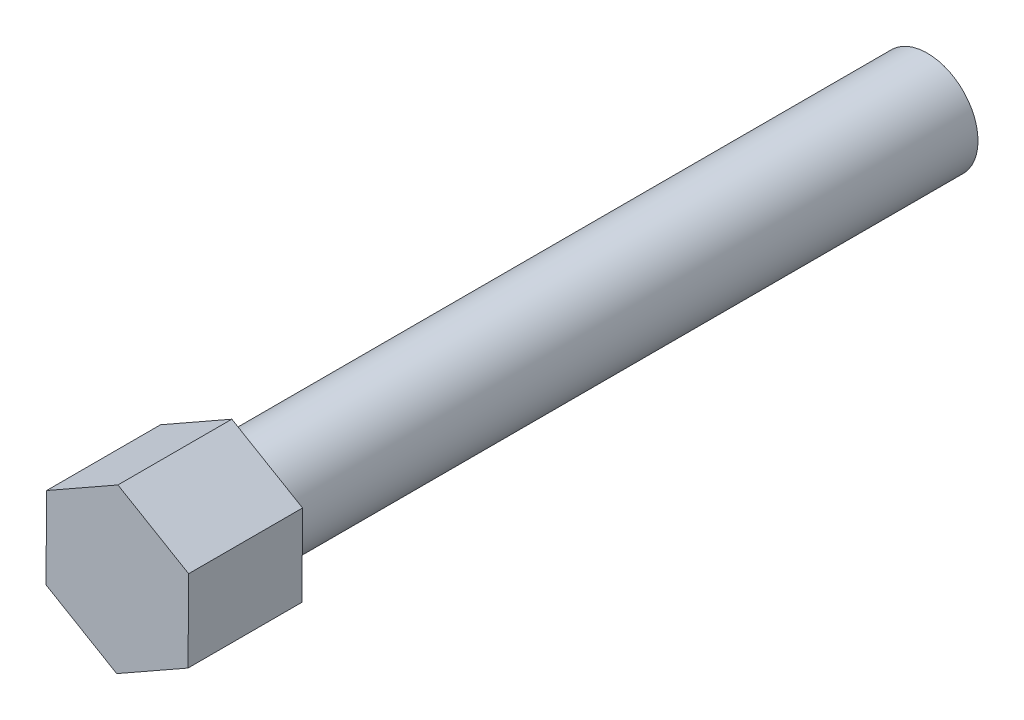
ISO-10303-21;
HEADER;
FILE_DESCRIPTION(('STEP AP214'),'2;1');
FILE_NAME('part.step','',(''),(''),'','','');
FILE_SCHEMA(('AUTOMOTIVE_DESIGN { 1 0 10303 214 1 1 1 1 }'));
ENDSEC;
DATA;
#1=APPLICATION_CONTEXT('core data for automotive mechanical design processes');
#2=APPLICATION_PROTOCOL_DEFINITION('international standard','automotive_design',2000,#1);
#3=PRODUCT_CONTEXT('',#1,'mechanical');
#4=PRODUCT('Part','Part','',(#3));
#5=PRODUCT_RELATED_PRODUCT_CATEGORY('part','',(#4));
#6=PRODUCT_DEFINITION_FORMATION('','',#4);
#7=PRODUCT_DEFINITION_CONTEXT('part definition',#1,'design');
#8=PRODUCT_DEFINITION('design','',#6,#7);
#9=PRODUCT_DEFINITION_SHAPE('','',#8);
#10=(LENGTH_UNIT() NAMED_UNIT(*) SI_UNIT(.MILLI.,.METRE.));
#11=(NAMED_UNIT(*) PLANE_ANGLE_UNIT() SI_UNIT($,.RADIAN.));
#12=(NAMED_UNIT(*) SI_UNIT($,.STERADIAN.) SOLID_ANGLE_UNIT());
#13=UNCERTAINTY_MEASURE_WITH_UNIT(LENGTH_MEASURE(1.E-05),#10,'distance_accuracy_value','');
#14=(GEOMETRIC_REPRESENTATION_CONTEXT(3) GLOBAL_UNCERTAINTY_ASSIGNED_CONTEXT((#13)) GLOBAL_UNIT_ASSIGNED_CONTEXT((#10,
#11,#12)) REPRESENTATION_CONTEXT('',''));
#15=CARTESIAN_POINT('',(0.,0.,0.));
#16=DIRECTION('',(0.,0.,1.));
#17=DIRECTION('',(1.,0.,0.));
#18=AXIS2_PLACEMENT_3D('',#15,#16,#17);
#19=CARTESIAN_POINT('',(0.,0.,55.));
#20=DIRECTION('',(0.,0.,-1.));
#21=DIRECTION('',(-1.,0.,0.));
#22=AXIS2_PLACEMENT_3D('',#19,#20,#21);
#23=CYLINDRICAL_SURFACE('',#22,4.);
#24=CARTESIAN_POINT('',(0.,0.,55.));
#25=DIRECTION('',(0.,0.,1.));
#26=DIRECTION('',(1.,0.,0.));
#27=AXIS2_PLACEMENT_3D('',#24,#25,#26);
#28=CIRCLE('',#27,4.);
#29=CARTESIAN_POINT('',(4.,0.,55.));
#30=VERTEX_POINT('',#29);
#31=EDGE_CURVE('E11',#30,#30,#28,.T.);
#32=ORIENTED_EDGE('',*,*,#31,.F.);
#33=EDGE_LOOP('',(#32));
#34=FACE_BOUND('',#33,.T.);
#35=CARTESIAN_POINT('',(0.,0.,0.));
#36=DIRECTION('',(0.,0.,1.));
#37=DIRECTION('',(1.,0.,0.));
#38=AXIS2_PLACEMENT_3D('',#35,#36,#37);
#39=CIRCLE('',#38,4.);
#40=CARTESIAN_POINT('',(4.,0.,0.));
#41=VERTEX_POINT('',#40);
#42=EDGE_CURVE('E40',#41,#41,#39,.T.);
#43=ORIENTED_EDGE('',*,*,#42,.T.);
#44=EDGE_LOOP('',(#43));
#45=FACE_BOUND('',#44,.T.);
#46=ADVANCED_FACE('F33',(#34,#45),#23,.T.);
#47=CARTESIAN_POINT('',(0.,0.,0.));
#48=DIRECTION('',(0.,0.,1.));
#49=DIRECTION('',(1.,0.,0.));
#50=AXIS2_PLACEMENT_3D('',#47,#48,#49);
#51=PLANE('',#50);
#52=ORIENTED_EDGE('',*,*,#42,.F.);
#53=EDGE_LOOP('',(#52));
#54=FACE_BOUND('',#53,.T.);
#55=ADVANCED_FACE('F141',(#54),#51,.F.);
#56=CARTESIAN_POINT('',(-5.5871853546911,3.28054919908483,55.));
#57=DIRECTION('',(0.,0.,1.));
#58=DIRECTION('',(1.,0.,0.));
#59=AXIS2_PLACEMENT_3D('',#56,#57,#58);
#60=PLANE('',#59);
#61=DIRECTION('',(-0.86966367276329,-0.493644706520656,0.));
#62=VECTOR('',#61,1.);
#63=CARTESIAN_POINT('',(0.0474462674266083,6.47891905235728,55.));
#64=LINE('',#63,#62);
#65=CARTESIAN_POINT('',(0.0474462674266083,6.47891905235728,55.));
#66=VERTEX_POINT('',#65);
#67=CARTESIAN_POINT('',(-5.5871853546911,3.28054919908483,55.));
#68=VERTEX_POINT('',#67);
#69=EDGE_CURVE('E91',#66,#68,#64,.T.);
#70=ORIENTED_EDGE('',*,*,#69,.F.);
#71=DIRECTION('',(-0.862340692672247,0.506328480101159,0.));
#72=VECTOR('',#71,1.);
#73=CARTESIAN_POINT('',(5.63463162211771,3.19836985327244,55.));
#74=LINE('',#73,#72);
#75=CARTESIAN_POINT('',(5.63463162211771,3.19836985327244,55.));
#76=VERTEX_POINT('',#75);
#77=EDGE_CURVE('E116',#76,#66,#74,.T.);
#78=ORIENTED_EDGE('',*,*,#77,.F.);
#79=DIRECTION('',(0.00732298009104386,0.999973186621815,0.));
#80=VECTOR('',#79,1.);
#81=CARTESIAN_POINT('',(5.5871853546911,-3.28054919908483,55.));
#82=LINE('',#81,#80);
#83=CARTESIAN_POINT('',(5.5871853546911,-3.28054919908483,55.));
#84=VERTEX_POINT('',#83);
#85=EDGE_CURVE('E114',#84,#76,#82,.T.);
#86=ORIENTED_EDGE('',*,*,#85,.F.);
#87=DIRECTION('',(0.869663672763291,0.493644706520656,0.));
#88=VECTOR('',#87,1.);
#89=CARTESIAN_POINT('',(-0.0474462674266069,-6.47891905235728,55.));
#90=LINE('',#89,#88);
#91=CARTESIAN_POINT('',(-0.0474462674266069,-6.47891905235728,55.));
#92=VERTEX_POINT('',#91);
#93=EDGE_CURVE('E112',#92,#84,#90,.T.);
#94=ORIENTED_EDGE('',*,*,#93,.F.);
#95=DIRECTION('',(0.862340692672247,-0.506328480101159,0.));
#96=VECTOR('',#95,1.);
#97=CARTESIAN_POINT('',(-5.63463162211771,-3.19836985327245,55.));
#98=LINE('',#97,#96);
#99=CARTESIAN_POINT('',(-5.63463162211771,-3.19836985327245,55.));
#100=VERTEX_POINT('',#99);
#101=EDGE_CURVE('E93',#100,#92,#98,.T.);
#102=ORIENTED_EDGE('',*,*,#101,.F.);
#103=DIRECTION('',(-0.00732298009104346,-0.999973186621814,0.));
#104=VECTOR('',#103,1.);
#105=CARTESIAN_POINT('',(-5.5871853546911,3.28054919908483,55.));
#106=LINE('',#105,#104);
#107=EDGE_CURVE('E85',#68,#100,#106,.T.);
#108=ORIENTED_EDGE('',*,*,#107,.F.);
#109=EDGE_LOOP('',(#70,#78,#86,#94,#102,#108));
#110=FACE_BOUND('',#109,.T.);
#111=ORIENTED_EDGE('',*,*,#31,.T.);
#112=EDGE_LOOP('',(#111));
#113=FACE_BOUND('',#112,.T.);
#114=ADVANCED_FACE('F87',(#110,#113),#60,.F.);
#115=CARTESIAN_POINT('',(0.0474462674266083,6.47891905235728,64.));
#116=DIRECTION('',(0.493644706520656,-0.86966367276329,0.));
#117=DIRECTION('',(0.869663672763291,0.493644706520656,0.));
#118=AXIS2_PLACEMENT_3D('',#115,#116,#117);
#119=PLANE('',#118);
#120=ORIENTED_EDGE('',*,*,#69,.T.);
#121=DIRECTION('',(0.,0.,-1.));
#122=VECTOR('',#121,1.);
#123=CARTESIAN_POINT('',(-5.5871853546911,3.28054919908483,64.));
#124=LINE('',#123,#122);
#125=CARTESIAN_POINT('',(-5.5871853546911,3.28054919908483,64.));
#126=VERTEX_POINT('',#125);
#127=EDGE_CURVE('E99',#126,#68,#124,.T.);
#128=ORIENTED_EDGE('',*,*,#127,.F.);
#129=DIRECTION('',(-0.86966367276329,-0.493644706520656,0.));
#130=VECTOR('',#129,1.);
#131=CARTESIAN_POINT('',(0.0474462674266083,6.47891905235728,64.));
#132=LINE('',#131,#130);
#133=CARTESIAN_POINT('',(0.0474462674266083,6.47891905235728,64.));
#134=VERTEX_POINT('',#133);
#135=EDGE_CURVE('E118',#134,#126,#132,.T.);
#136=ORIENTED_EDGE('',*,*,#135,.F.);
#137=DIRECTION('',(0.,0.,-1.));
#138=VECTOR('',#137,1.);
#139=CARTESIAN_POINT('',(0.0474462674266083,6.47891905235728,64.));
#140=LINE('',#139,#138);
#141=EDGE_CURVE('E108',#134,#66,#140,.T.);
#142=ORIENTED_EDGE('',*,*,#141,.T.);
#143=EDGE_LOOP('',(#120,#128,#136,#142));
#144=FACE_BOUND('',#143,.T.);
#145=ADVANCED_FACE('F107',(#144),#119,.F.);
#146=CARTESIAN_POINT('',(-5.5871853546911,3.28054919908483,64.));
#147=DIRECTION('',(0.999973186621814,-0.00732298009104346,0.));
#148=DIRECTION('',(0.00732298009104346,0.999973186621815,0.));
#149=AXIS2_PLACEMENT_3D('',#146,#147,#148);
#150=PLANE('',#149);
#151=ORIENTED_EDGE('',*,*,#107,.T.);
#152=DIRECTION('',(0.,0.,-1.));
#153=VECTOR('',#152,1.);
#154=CARTESIAN_POINT('',(-5.63463162211771,-3.19836985327245,64.));
#155=LINE('',#154,#153);
#156=CARTESIAN_POINT('',(-5.63463162211771,-3.19836985327245,64.));
#157=VERTEX_POINT('',#156);
#158=EDGE_CURVE('E104',#157,#100,#155,.T.);
#159=ORIENTED_EDGE('',*,*,#158,.F.);
#160=DIRECTION('',(-0.00732298009104346,-0.999973186621814,0.));
#161=VECTOR('',#160,1.);
#162=CARTESIAN_POINT('',(-5.5871853546911,3.28054919908483,64.));
#163=LINE('',#162,#161);
#164=EDGE_CURVE('E101',#126,#157,#163,.T.);
#165=ORIENTED_EDGE('',*,*,#164,.F.);
#166=ORIENTED_EDGE('',*,*,#127,.T.);
#167=EDGE_LOOP('',(#151,#159,#165,#166));
#168=FACE_BOUND('',#167,.T.);
#169=ADVANCED_FACE('F100',(#168),#150,.F.);
#170=CARTESIAN_POINT('',(-5.63463162211771,-3.19836985327245,64.));
#171=DIRECTION('',(0.506328480101158,0.862340692672247,0.));
#172=DIRECTION('',(-0.862340692672247,0.506328480101158,0.));
#173=AXIS2_PLACEMENT_3D('',#170,#171,#172);
#174=PLANE('',#173);
#175=ORIENTED_EDGE('',*,*,#101,.T.);
#176=DIRECTION('',(0.,0.,-1.));
#177=VECTOR('',#176,1.);
#178=CARTESIAN_POINT('',(-0.0474462674266069,-6.47891905235728,64.));
#179=LINE('',#178,#177);
#180=CARTESIAN_POINT('',(-0.0474462674266069,-6.47891905235728,64.));
#181=VERTEX_POINT('',#180);
#182=EDGE_CURVE('E134',#181,#92,#179,.T.);
#183=ORIENTED_EDGE('',*,*,#182,.F.);
#184=DIRECTION('',(0.862340692672247,-0.506328480101159,0.));
#185=VECTOR('',#184,1.);
#186=CARTESIAN_POINT('',(-5.63463162211771,-3.19836985327245,64.));
#187=LINE('',#186,#185);
#188=EDGE_CURVE('E121',#157,#181,#187,.T.);
#189=ORIENTED_EDGE('',*,*,#188,.F.);
#190=ORIENTED_EDGE('',*,*,#158,.T.);
#191=EDGE_LOOP('',(#175,#183,#189,#190));
#192=FACE_BOUND('',#191,.T.);
#193=ADVANCED_FACE('F154',(#192),#174,.F.);
#194=CARTESIAN_POINT('',(-0.0474462674266069,-6.47891905235728,64.));
#195=DIRECTION('',(-0.493644706520656,0.869663672763291,0.));
#196=DIRECTION('',(-0.869663672763291,-0.493644706520656,0.));
#197=AXIS2_PLACEMENT_3D('',#194,#195,#196);
#198=PLANE('',#197);
#199=ORIENTED_EDGE('',*,*,#93,.T.);
#200=DIRECTION('',(0.,0.,-1.));
#201=VECTOR('',#200,1.);
#202=CARTESIAN_POINT('',(5.5871853546911,-3.28054919908483,64.));
#203=LINE('',#202,#201);
#204=CARTESIAN_POINT('',(5.5871853546911,-3.28054919908483,64.));
#205=VERTEX_POINT('',#204);
#206=EDGE_CURVE('E131',#205,#84,#203,.T.);
#207=ORIENTED_EDGE('',*,*,#206,.F.);
#208=DIRECTION('',(0.869663672763291,0.493644706520656,0.));
#209=VECTOR('',#208,1.);
#210=CARTESIAN_POINT('',(-0.0474462674266069,-6.47891905235728,64.));
#211=LINE('',#210,#209);
#212=EDGE_CURVE('E123',#181,#205,#211,.T.);
#213=ORIENTED_EDGE('',*,*,#212,.F.);
#214=ORIENTED_EDGE('',*,*,#182,.T.);
#215=EDGE_LOOP('',(#199,#207,#213,#214));
#216=FACE_BOUND('',#215,.T.);
#217=ADVANCED_FACE('F157',(#216),#198,.F.);
#218=CARTESIAN_POINT('',(5.5871853546911,-3.28054919908483,64.));
#219=DIRECTION('',(-0.999973186621814,0.00732298009104386,0.));
#220=DIRECTION('',(-0.00732298009104386,-0.999973186621814,0.));
#221=AXIS2_PLACEMENT_3D('',#218,#219,#220);
#222=PLANE('',#221);
#223=ORIENTED_EDGE('',*,*,#85,.T.);
#224=DIRECTION('',(0.,0.,-1.));
#225=VECTOR('',#224,1.);
#226=CARTESIAN_POINT('',(5.63463162211771,3.19836985327244,64.));
#227=LINE('',#226,#225);
#228=CARTESIAN_POINT('',(5.63463162211771,3.19836985327244,64.));
#229=VERTEX_POINT('',#228);
#230=EDGE_CURVE('E128',#229,#76,#227,.T.);
#231=ORIENTED_EDGE('',*,*,#230,.F.);
#232=DIRECTION('',(0.00732298009104386,0.999973186621815,0.));
#233=VECTOR('',#232,1.);
#234=CARTESIAN_POINT('',(5.5871853546911,-3.28054919908483,64.));
#235=LINE('',#234,#233);
#236=EDGE_CURVE('E52',#205,#229,#235,.T.);
#237=ORIENTED_EDGE('',*,*,#236,.F.);
#238=ORIENTED_EDGE('',*,*,#206,.T.);
#239=EDGE_LOOP('',(#223,#231,#237,#238));
#240=FACE_BOUND('',#239,.T.);
#241=ADVANCED_FACE('F161',(#240),#222,.F.);
#242=CARTESIAN_POINT('',(5.63463162211771,3.19836985327244,64.));
#243=DIRECTION('',(-0.506328480101159,-0.862340692672247,0.));
#244=DIRECTION('',(0.862340692672247,-0.506328480101159,0.));
#245=AXIS2_PLACEMENT_3D('',#242,#243,#244);
#246=PLANE('',#245);
#247=ORIENTED_EDGE('',*,*,#77,.T.);
#248=ORIENTED_EDGE('',*,*,#141,.F.);
#249=DIRECTION('',(-0.862340692672247,0.506328480101159,0.));
#250=VECTOR('',#249,1.);
#251=CARTESIAN_POINT('',(5.63463162211771,3.19836985327244,64.));
#252=LINE('',#251,#250);
#253=EDGE_CURVE('E47',#229,#134,#252,.T.);
#254=ORIENTED_EDGE('',*,*,#253,.F.);
#255=ORIENTED_EDGE('',*,*,#230,.T.);
#256=EDGE_LOOP('',(#247,#248,#254,#255));
#257=FACE_BOUND('',#256,.T.);
#258=ADVANCED_FACE('F165',(#257),#246,.F.);
#259=CARTESIAN_POINT('',(-5.5871853546911,3.28054919908483,64.));
#260=DIRECTION('',(0.,0.,1.));
#261=DIRECTION('',(1.,0.,0.));
#262=AXIS2_PLACEMENT_3D('',#259,#260,#261);
#263=PLANE('',#262);
#264=ORIENTED_EDGE('',*,*,#135,.T.);
#265=ORIENTED_EDGE('',*,*,#164,.T.);
#266=ORIENTED_EDGE('',*,*,#188,.T.);
#267=ORIENTED_EDGE('',*,*,#212,.T.);
#268=ORIENTED_EDGE('',*,*,#236,.T.);
#269=ORIENTED_EDGE('',*,*,#253,.T.);
#270=EDGE_LOOP('',(#264,#265,#266,#267,#268,#269));
#271=FACE_BOUND('',#270,.T.);
#272=ADVANCED_FACE('F169',(#271),#263,.T.);
#273=CLOSED_SHELL('',(#46,#55,#114,#145,#169,#193,#217,#241,#258,#272));
#274=MANIFOLD_SOLID_BREP('B2',#273);
#275=ADVANCED_BREP_SHAPE_REPRESENTATION('',(#18,#274),#14);
#276=SHAPE_DEFINITION_REPRESENTATION(#9,#275);
ENDSEC;
END-ISO-10303-21;
